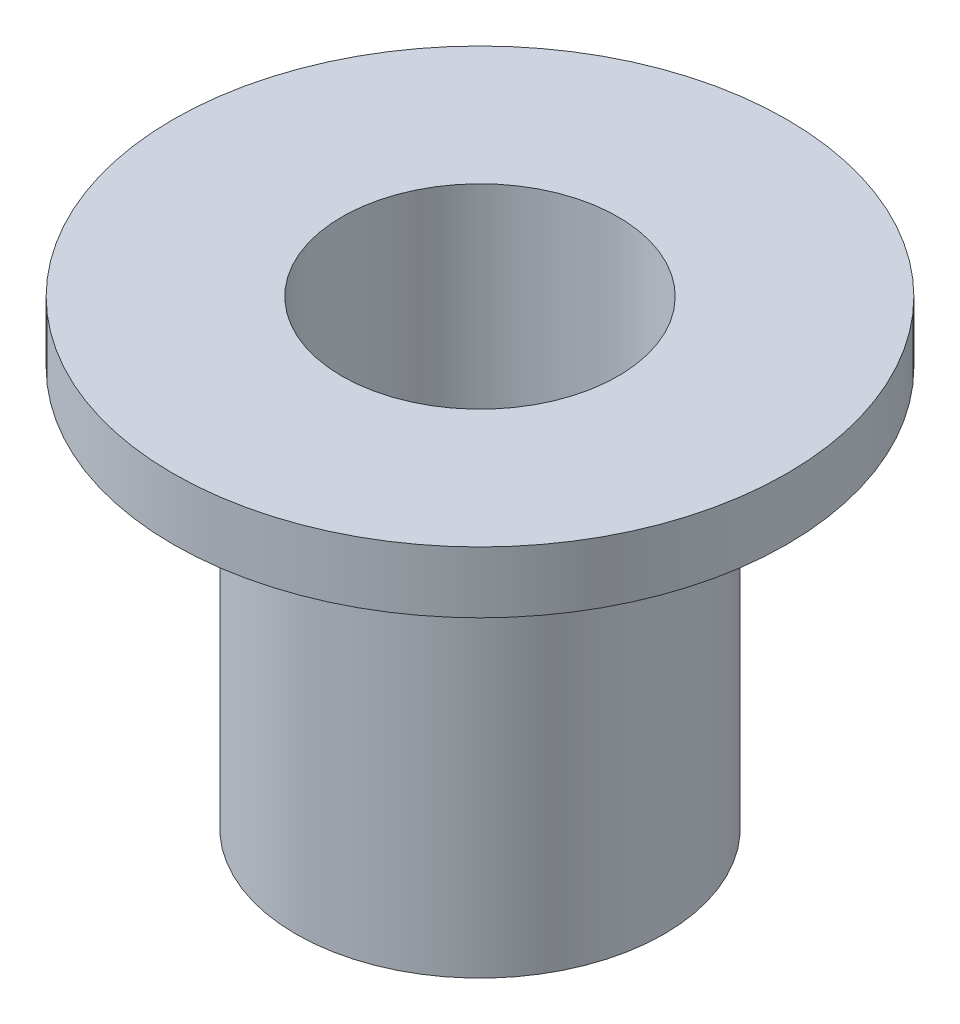
ISO-10303-21;
HEADER;
FILE_DESCRIPTION(('STEP AP214'),'2;1');
FILE_NAME('part.step','',(''),(''),'','','');
FILE_SCHEMA(('AUTOMOTIVE_DESIGN { 1 0 10303 214 1 1 1 1 }'));
ENDSEC;
DATA;
#1=APPLICATION_CONTEXT('core data for automotive mechanical design processes');
#2=APPLICATION_PROTOCOL_DEFINITION('international standard','automotive_design',2000,#1);
#3=PRODUCT_CONTEXT('',#1,'mechanical');
#4=PRODUCT('Part','Part','',(#3));
#5=PRODUCT_RELATED_PRODUCT_CATEGORY('part','',(#4));
#6=PRODUCT_DEFINITION_FORMATION('','',#4);
#7=PRODUCT_DEFINITION_CONTEXT('part definition',#1,'design');
#8=PRODUCT_DEFINITION('design','',#6,#7);
#9=PRODUCT_DEFINITION_SHAPE('','',#8);
#10=(LENGTH_UNIT() NAMED_UNIT(*) SI_UNIT(.MILLI.,.METRE.));
#11=(NAMED_UNIT(*) PLANE_ANGLE_UNIT() SI_UNIT($,.RADIAN.));
#12=(NAMED_UNIT(*) SI_UNIT($,.STERADIAN.) SOLID_ANGLE_UNIT());
#13=UNCERTAINTY_MEASURE_WITH_UNIT(LENGTH_MEASURE(1.E-05),#10,'distance_accuracy_value','');
#14=(GEOMETRIC_REPRESENTATION_CONTEXT(3) GLOBAL_UNCERTAINTY_ASSIGNED_CONTEXT((#13)) GLOBAL_UNIT_ASSIGNED_CONTEXT((#10,
#11,#12)) REPRESENTATION_CONTEXT('',''));
#15=CARTESIAN_POINT('',(0.,0.,0.));
#16=DIRECTION('',(0.,0.,1.));
#17=DIRECTION('',(1.,0.,0.));
#18=AXIS2_PLACEMENT_3D('',#15,#16,#17);
#19=CARTESIAN_POINT('',(0.,15.,0.));
#20=DIRECTION('',(0.,-1.,0.));
#21=DIRECTION('',(0.,0.,-1.));
#22=AXIS2_PLACEMENT_3D('',#19,#20,#21);
#23=CYLINDRICAL_SURFACE('',#22,6.);
#24=CARTESIAN_POINT('',(0.,0.,0.));
#25=DIRECTION('',(0.,1.,0.));
#26=DIRECTION('',(0.,0.,1.));
#27=AXIS2_PLACEMENT_3D('',#24,#25,#26);
#28=CIRCLE('',#27,6.);
#29=CARTESIAN_POINT('',(0.,0.,6.));
#30=VERTEX_POINT('',#29);
#31=EDGE_CURVE('E44',#30,#30,#28,.T.);
#32=ORIENTED_EDGE('',*,*,#31,.T.);
#33=EDGE_LOOP('',(#32));
#34=FACE_BOUND('',#33,.T.);
#35=CARTESIAN_POINT('',(0.,13.,0.));
#36=DIRECTION('',(0.,1.,0.));
#37=DIRECTION('',(0.,0.,1.));
#38=AXIS2_PLACEMENT_3D('',#35,#36,#37);
#39=CIRCLE('',#38,6.);
#40=CARTESIAN_POINT('',(0.,13.,6.));
#41=VERTEX_POINT('',#40);
#42=EDGE_CURVE('E10',#41,#41,#39,.T.);
#43=ORIENTED_EDGE('',*,*,#42,.F.);
#44=EDGE_LOOP('',(#43));
#45=FACE_BOUND('',#44,.T.);
#46=ADVANCED_FACE('F37',(#34,#45),#23,.T.);
#47=CARTESIAN_POINT('',(0.,0.,0.));
#48=DIRECTION('',(0.,1.,0.));
#49=DIRECTION('',(0.,0.,1.));
#50=AXIS2_PLACEMENT_3D('',#47,#48,#49);
#51=PLANE('',#50);
#52=CARTESIAN_POINT('',(0.,0.,0.));
#53=DIRECTION('',(0.,1.,0.));
#54=DIRECTION('',(0.,0.,1.));
#55=AXIS2_PLACEMENT_3D('',#52,#53,#54);
#56=CIRCLE('',#55,1.25);
#57=CARTESIAN_POINT('',(0.,0.,1.25));
#58=VERTEX_POINT('',#57);
#59=EDGE_CURVE('E65',#58,#58,#56,.T.);
#60=ORIENTED_EDGE('',*,*,#59,.T.);
#61=EDGE_LOOP('',(#60));
#62=FACE_BOUND('',#61,.T.);
#63=ORIENTED_EDGE('',*,*,#31,.F.);
#64=EDGE_LOOP('',(#63));
#65=FACE_BOUND('',#64,.T.);
#66=ADVANCED_FACE('F77',(#62,#65),#51,.F.);
#67=CARTESIAN_POINT('',(0.,13.,0.));
#68=DIRECTION('',(0.,1.,0.));
#69=DIRECTION('',(0.,0.,1.));
#70=AXIS2_PLACEMENT_3D('',#67,#68,#69);
#71=CYLINDRICAL_SURFACE('',#70,10.);
#72=CARTESIAN_POINT('',(0.,13.,0.));
#73=DIRECTION('',(0.,1.,0.));
#74=DIRECTION('',(0.,0.,1.));
#75=AXIS2_PLACEMENT_3D('',#72,#73,#74);
#76=CIRCLE('',#75,10.);
#77=CARTESIAN_POINT('',(0.,13.,10.));
#78=VERTEX_POINT('',#77);
#79=EDGE_CURVE('E49',#78,#78,#76,.T.);
#80=ORIENTED_EDGE('',*,*,#79,.T.);
#81=EDGE_LOOP('',(#80));
#82=FACE_BOUND('',#81,.T.);
#83=CARTESIAN_POINT('',(0.,15.,0.));
#84=DIRECTION('',(0.,1.,0.));
#85=DIRECTION('',(0.,0.,1.));
#86=AXIS2_PLACEMENT_3D('',#83,#84,#85);
#87=CIRCLE('',#86,10.);
#88=CARTESIAN_POINT('',(0.,15.,10.));
#89=VERTEX_POINT('',#88);
#90=EDGE_CURVE('E54',#89,#89,#87,.T.);
#91=ORIENTED_EDGE('',*,*,#90,.F.);
#92=EDGE_LOOP('',(#91));
#93=FACE_BOUND('',#92,.T.);
#94=ADVANCED_FACE('F105',(#82,#93),#71,.T.);
#95=CARTESIAN_POINT('',(0.,13.,0.));
#96=DIRECTION('',(0.,1.,0.));
#97=DIRECTION('',(0.,0.,1.));
#98=AXIS2_PLACEMENT_3D('',#95,#96,#97);
#99=PLANE('',#98);
#100=ORIENTED_EDGE('',*,*,#42,.T.);
#101=EDGE_LOOP('',(#100));
#102=FACE_BOUND('',#101,.T.);
#103=ORIENTED_EDGE('',*,*,#79,.F.);
#104=EDGE_LOOP('',(#103));
#105=FACE_BOUND('',#104,.T.);
#106=ADVANCED_FACE('F101',(#102,#105),#99,.F.);
#107=CARTESIAN_POINT('',(0.,15.,0.));
#108=DIRECTION('',(0.,1.,0.));
#109=DIRECTION('',(0.,0.,1.));
#110=AXIS2_PLACEMENT_3D('',#107,#108,#109);
#111=PLANE('',#110);
#112=CARTESIAN_POINT('',(0.,15.,0.));
#113=DIRECTION('',(0.,1.,0.));
#114=DIRECTION('',(0.,0.,1.));
#115=AXIS2_PLACEMENT_3D('',#112,#113,#114);
#116=CIRCLE('',#115,4.5);
#117=CARTESIAN_POINT('',(0.,15.,4.5));
#118=VERTEX_POINT('',#117);
#119=EDGE_CURVE('E61',#118,#118,#116,.T.);
#120=ORIENTED_EDGE('',*,*,#119,.F.);
#121=EDGE_LOOP('',(#120));
#122=FACE_BOUND('',#121,.T.);
#123=ORIENTED_EDGE('',*,*,#90,.T.);
#124=EDGE_LOOP('',(#123));
#125=FACE_BOUND('',#124,.T.);
#126=ADVANCED_FACE('F95',(#122,#125),#111,.T.);
#127=CARTESIAN_POINT('',(0.,2.,0.));
#128=DIRECTION('',(0.,1.,0.));
#129=DIRECTION('',(0.,0.,1.));
#130=AXIS2_PLACEMENT_3D('',#127,#128,#129);
#131=CYLINDRICAL_SURFACE('',#130,4.5);
#132=CARTESIAN_POINT('',(0.,2.,0.));
#133=DIRECTION('',(0.,1.,0.));
#134=DIRECTION('',(0.,0.,1.));
#135=AXIS2_PLACEMENT_3D('',#132,#133,#134);
#136=CIRCLE('',#135,4.5);
#137=CARTESIAN_POINT('',(0.,2.,4.5));
#138=VERTEX_POINT('',#137);
#139=EDGE_CURVE('E59',#138,#138,#136,.T.);
#140=CARTESIAN_POINT('',(0.,2.,4.5));
#141=CARTESIAN_POINT('',(0.,2.13541666666667,4.5));
#142=CARTESIAN_POINT('',(0.,2.27083333333333,4.5));
#143=CARTESIAN_POINT('',(0.,2.54166666666667,4.5));
#144=CARTESIAN_POINT('',(0.,2.67708333333333,4.5));
#145=CARTESIAN_POINT('',(0.,2.94791666666667,4.5));
#146=CARTESIAN_POINT('',(0.,3.08333333333333,4.5));
#147=CARTESIAN_POINT('',(0.,3.35416666666667,4.5));
#148=CARTESIAN_POINT('',(0.,3.48958333333333,4.5));
#149=CARTESIAN_POINT('',(0.,3.76041666666667,4.5));
#150=CARTESIAN_POINT('',(0.,3.89583333333333,4.5));
#151=CARTESIAN_POINT('',(0.,4.16666666666667,4.5));
#152=CARTESIAN_POINT('',(0.,4.30208333333333,4.5));
#153=CARTESIAN_POINT('',(0.,4.57291666666667,4.5));
#154=CARTESIAN_POINT('',(0.,4.70833333333333,4.5));
#155=CARTESIAN_POINT('',(0.,4.97916666666667,4.5));
#156=CARTESIAN_POINT('',(0.,5.11458333333333,4.5));
#157=CARTESIAN_POINT('',(0.,5.38541666666667,4.5));
#158=CARTESIAN_POINT('',(0.,5.52083333333333,4.5));
#159=CARTESIAN_POINT('',(0.,5.79166666666667,4.5));
#160=CARTESIAN_POINT('',(0.,5.92708333333333,4.5));
#161=CARTESIAN_POINT('',(0.,6.19791666666667,4.5));
#162=CARTESIAN_POINT('',(0.,6.33333333333333,4.5));
#163=CARTESIAN_POINT('',(0.,6.60416666666667,4.5));
#164=CARTESIAN_POINT('',(0.,6.73958333333333,4.5));
#165=CARTESIAN_POINT('',(0.,7.01041666666667,4.5));
#166=CARTESIAN_POINT('',(0.,7.14583333333333,4.5));
#167=CARTESIAN_POINT('',(0.,7.41666666666667,4.5));
#168=CARTESIAN_POINT('',(0.,7.55208333333333,4.5));
#169=CARTESIAN_POINT('',(0.,7.82291666666667,4.5));
#170=CARTESIAN_POINT('',(0.,7.95833333333333,4.5));
#171=CARTESIAN_POINT('',(0.,8.22916666666667,4.5));
#172=CARTESIAN_POINT('',(0.,8.36458333333333,4.5));
#173=CARTESIAN_POINT('',(0.,8.63541666666667,4.5));
#174=CARTESIAN_POINT('',(0.,8.77083333333333,4.5));
#175=CARTESIAN_POINT('',(0.,9.04166666666667,4.5));
#176=CARTESIAN_POINT('',(0.,9.17708333333333,4.5));
#177=CARTESIAN_POINT('',(0.,9.44791666666667,4.5));
#178=CARTESIAN_POINT('',(0.,9.58333333333333,4.5));
#179=CARTESIAN_POINT('',(0.,9.85416666666667,4.5));
#180=CARTESIAN_POINT('',(0.,9.98958333333333,4.5));
#181=CARTESIAN_POINT('',(0.,10.2604166666667,4.5));
#182=CARTESIAN_POINT('',(0.,10.3958333333333,4.5));
#183=CARTESIAN_POINT('',(0.,10.6666666666667,4.5));
#184=CARTESIAN_POINT('',(0.,10.8020833333333,4.5));
#185=CARTESIAN_POINT('',(0.,11.0729166666667,4.5));
#186=CARTESIAN_POINT('',(0.,11.2083333333333,4.5));
#187=CARTESIAN_POINT('',(0.,11.4791666666667,4.5));
#188=CARTESIAN_POINT('',(0.,11.6145833333333,4.5));
#189=CARTESIAN_POINT('',(0.,11.8854166666667,4.5));
#190=CARTESIAN_POINT('',(0.,12.0208333333333,4.5));
#191=CARTESIAN_POINT('',(0.,12.2916666666667,4.5));
#192=CARTESIAN_POINT('',(0.,12.4270833333333,4.5));
#193=CARTESIAN_POINT('',(0.,12.6979166666667,4.5));
#194=CARTESIAN_POINT('',(0.,12.8333333333333,4.5));
#195=CARTESIAN_POINT('',(0.,13.1041666666667,4.5));
#196=CARTESIAN_POINT('',(0.,13.2395833333333,4.5));
#197=CARTESIAN_POINT('',(0.,13.5104166666667,4.5));
#198=CARTESIAN_POINT('',(0.,13.6458333333333,4.5));
#199=CARTESIAN_POINT('',(0.,13.9166666666667,4.5));
#200=CARTESIAN_POINT('',(0.,14.0520833333333,4.5));
#201=CARTESIAN_POINT('',(0.,14.3229166666667,4.5));
#202=CARTESIAN_POINT('',(0.,14.4583333333333,4.5));
#203=CARTESIAN_POINT('',(0.,14.7291666666667,4.5));
#204=CARTESIAN_POINT('',(0.,14.8645833333333,4.5));
#205=CARTESIAN_POINT('',(0.,15.,4.5));
#206=B_SPLINE_CURVE_WITH_KNOTS('',3,(#140,#141,#142,#143,#144,#145,#146,#147,#148,#149,#150,
#151,#152,#153,#154,#155,#156,#157,#158,#159,#160,#161,#162,#163,#164,#165,#166,#167,#168,#169,
#170,#171,#172,#173,#174,#175,#176,#177,#178,#179,#180,#181,#182,#183,#184,#185,#186,#187,#188,
#189,#190,#191,#192,#193,#194,#195,#196,#197,#198,#199,#200,#201,#202,#203,#204,#205),
.UNSPECIFIED.,.F.,.F.,(4,2,2,2,2,2,2,2,2,2,2,2,2,2,2,2,2,2,2,2,2,2,2,2,2,2,2,2,2,2,2,2,4),(0.,
0.40625,0.8125,1.21875,1.625,2.03125,2.4375,2.84375,3.25,3.65625,4.0625,4.46875,4.875,5.28125,
5.6875,6.09375,6.5,6.90625,7.3125,7.71875,8.125,8.53125,8.9375,9.34375,9.75,10.15625,10.5625,
10.96875,11.375,11.78125,12.1875,12.59375,13.),.UNSPECIFIED.);
#207=EDGE_CURVE('BSEAM89',#138,#118,#206,.T.);
#208=ORIENTED_EDGE('',*,*,#139,.F.);
#209=ORIENTED_EDGE('',*,*,#119,.T.);
#210=ORIENTED_EDGE('',*,*,#207,.T.);
#211=ORIENTED_EDGE('',*,*,#207,.F.);
#212=EDGE_LOOP('',(#208,#210,#209,#211));
#213=FACE_BOUND('',#212,.T.);
#214=ADVANCED_FACE('F89',(#213),#131,.F.);
#215=CARTESIAN_POINT('',(0.,2.,0.));
#216=DIRECTION('',(0.,1.,0.));
#217=DIRECTION('',(0.,0.,1.));
#218=AXIS2_PLACEMENT_3D('',#215,#216,#217);
#219=PLANE('',#218);
#220=CARTESIAN_POINT('',(0.,2.,0.));
#221=DIRECTION('',(0.,1.,0.));
#222=DIRECTION('',(0.,0.,1.));
#223=AXIS2_PLACEMENT_3D('',#220,#221,#222);
#224=CIRCLE('',#223,1.25);
#225=CARTESIAN_POINT('',(0.,2.,1.25));
#226=VERTEX_POINT('',#225);
#227=EDGE_CURVE('E69',#226,#226,#224,.T.);
#228=ORIENTED_EDGE('',*,*,#227,.F.);
#229=EDGE_LOOP('',(#228));
#230=FACE_BOUND('',#229,.T.);
#231=ORIENTED_EDGE('',*,*,#139,.T.);
#232=EDGE_LOOP('',(#231));
#233=FACE_BOUND('',#232,.T.);
#234=ADVANCED_FACE('F83',(#230,#233),#219,.T.);
#235=CARTESIAN_POINT('',(0.,0.,0.));
#236=DIRECTION('',(0.,1.,0.));
#237=DIRECTION('',(0.,0.,1.));
#238=AXIS2_PLACEMENT_3D('',#235,#236,#237);
#239=CYLINDRICAL_SURFACE('',#238,1.25);
#240=ORIENTED_EDGE('',*,*,#59,.F.);
#241=EDGE_LOOP('',(#240));
#242=FACE_BOUND('',#241,.T.);
#243=ORIENTED_EDGE('',*,*,#227,.T.);
#244=EDGE_LOOP('',(#243));
#245=FACE_BOUND('',#244,.T.);
#246=ADVANCED_FACE('F80',(#242,#245),#239,.F.);
#247=CLOSED_SHELL('',(#46,#66,#94,#106,#126,#214,#234,#246));
#248=MANIFOLD_SOLID_BREP('B2',#247);
#249=ADVANCED_BREP_SHAPE_REPRESENTATION('',(#18,#248),#14);
#250=SHAPE_DEFINITION_REPRESENTATION(#9,#249);
ENDSEC;
END-ISO-10303-21;
